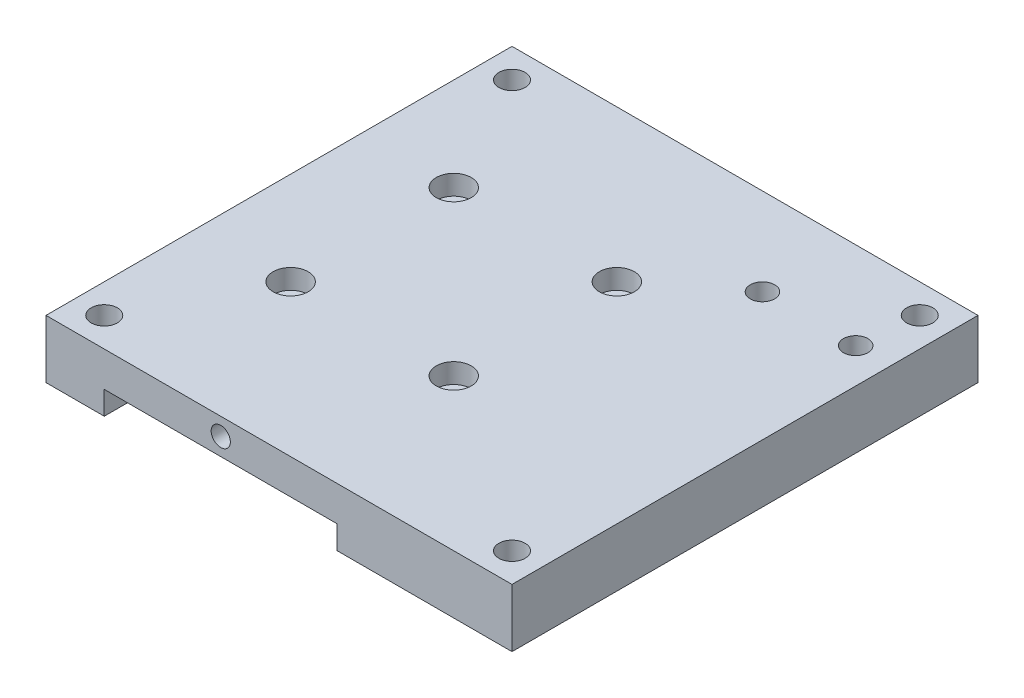
ISO-10303-21;
HEADER;
FILE_DESCRIPTION(('STEP AP214'),'2;1');
FILE_NAME('part.step','',(''),(''),'','','');
FILE_SCHEMA(('AUTOMOTIVE_DESIGN { 1 0 10303 214 1 1 1 1 }'));
ENDSEC;
DATA;
#1=APPLICATION_CONTEXT('core data for automotive mechanical design processes');
#2=APPLICATION_PROTOCOL_DEFINITION('international standard','automotive_design',2000,#1);
#3=PRODUCT_CONTEXT('',#1,'mechanical');
#4=PRODUCT('Part','Part','',(#3));
#5=PRODUCT_RELATED_PRODUCT_CATEGORY('part','',(#4));
#6=PRODUCT_DEFINITION_FORMATION('','',#4);
#7=PRODUCT_DEFINITION_CONTEXT('part definition',#1,'design');
#8=PRODUCT_DEFINITION('design','',#6,#7);
#9=PRODUCT_DEFINITION_SHAPE('','',#8);
#10=(LENGTH_UNIT() NAMED_UNIT(*) SI_UNIT(.MILLI.,.METRE.));
#11=(NAMED_UNIT(*) PLANE_ANGLE_UNIT() SI_UNIT($,.RADIAN.));
#12=(NAMED_UNIT(*) SI_UNIT($,.STERADIAN.) SOLID_ANGLE_UNIT());
#13=UNCERTAINTY_MEASURE_WITH_UNIT(LENGTH_MEASURE(1.E-05),#10,'distance_accuracy_value','');
#14=(GEOMETRIC_REPRESENTATION_CONTEXT(3) GLOBAL_UNCERTAINTY_ASSIGNED_CONTEXT((#13)) GLOBAL_UNIT_ASSIGNED_CONTEXT((#10,
#11,#12)) REPRESENTATION_CONTEXT('',''));
#15=CARTESIAN_POINT('',(0.,0.,0.));
#16=DIRECTION('',(0.,0.,1.));
#17=DIRECTION('',(1.,0.,0.));
#18=AXIS2_PLACEMENT_3D('',#15,#16,#17);
#19=CARTESIAN_POINT('',(0.,0.,0.));
#20=DIRECTION('',(0.,-1.,0.));
#21=DIRECTION('',(0.,0.,-1.));
#22=AXIS2_PLACEMENT_3D('',#19,#20,#21);
#23=PLANE('',#22);
#24=CARTESIAN_POINT('',(-35.,0.,35.));
#25=DIRECTION('',(0.,-1.,0.));
#26=DIRECTION('',(0.,0.,-1.));
#27=AXIS2_PLACEMENT_3D('',#24,#25,#26);
#28=CIRCLE('',#27,4.);
#29=CARTESIAN_POINT('',(-35.,0.,31.));
#30=VERTEX_POINT('',#29);
#31=EDGE_CURVE('E126',#30,#30,#28,.T.);
#32=ORIENTED_EDGE('',*,*,#31,.F.);
#33=EDGE_LOOP('',(#32));
#34=FACE_BOUND('',#33,.T.);
#35=CARTESIAN_POINT('',(-35.,0.,-35.));
#36=DIRECTION('',(0.,-1.,0.));
#37=DIRECTION('',(0.,0.,-1.));
#38=AXIS2_PLACEMENT_3D('',#35,#36,#37);
#39=CIRCLE('',#38,4.);
#40=CARTESIAN_POINT('',(-35.,0.,-39.));
#41=VERTEX_POINT('',#40);
#42=EDGE_CURVE('E167',#41,#41,#39,.T.);
#43=ORIENTED_EDGE('',*,*,#42,.F.);
#44=EDGE_LOOP('',(#43));
#45=FACE_BOUND('',#44,.T.);
#46=DIRECTION('',(0.,0.,1.));
#47=VECTOR('',#46,1.);
#48=CARTESIAN_POINT('',(-30.,0.,-40.));
#49=LINE('',#48,#47);
#50=CARTESIAN_POINT('',(-30.,0.,-40.));
#51=VERTEX_POINT('',#50);
#52=CARTESIAN_POINT('',(-30.,0.,40.));
#53=VERTEX_POINT('',#52);
#54=EDGE_CURVE('E238',#51,#53,#49,.T.);
#55=ORIENTED_EDGE('',*,*,#54,.T.);
#56=DIRECTION('',(1.,0.,0.));
#57=VECTOR('',#56,1.);
#58=CARTESIAN_POINT('',(-40.,0.,40.));
#59=LINE('',#58,#57);
#60=CARTESIAN_POINT('',(-40.,0.,40.));
#61=VERTEX_POINT('',#60);
#62=EDGE_CURVE('E257',#61,#53,#59,.T.);
#63=ORIENTED_EDGE('',*,*,#62,.F.);
#64=DIRECTION('',(0.,0.,1.));
#65=VECTOR('',#64,1.);
#66=CARTESIAN_POINT('',(-40.,0.,40.));
#67=LINE('',#66,#65);
#68=CARTESIAN_POINT('',(-40.,0.,-40.));
#69=VERTEX_POINT('',#68);
#70=EDGE_CURVE('E269',#69,#61,#67,.T.);
#71=ORIENTED_EDGE('',*,*,#70,.F.);
#72=DIRECTION('',(-1.,0.,0.));
#73=VECTOR('',#72,1.);
#74=CARTESIAN_POINT('',(-40.,0.,-40.));
#75=LINE('',#74,#73);
#76=EDGE_CURVE('E265',#51,#69,#75,.T.);
#77=ORIENTED_EDGE('',*,*,#76,.F.);
#78=EDGE_LOOP('',(#55,#63,#71,#77));
#79=FACE_BOUND('',#78,.T.);
#80=ADVANCED_FACE('F39',(#34,#45,#79),#23,.T.);
#81=CARTESIAN_POINT('',(40.,10.,40.));
#82=DIRECTION('',(-1.,0.,0.));
#83=DIRECTION('',(0.,0.,1.));
#84=AXIS2_PLACEMENT_3D('',#81,#82,#83);
#85=PLANE('',#84);
#86=DIRECTION('',(0.,0.,-1.));
#87=VECTOR('',#86,1.);
#88=CARTESIAN_POINT('',(40.,0.,40.));
#89=LINE('',#88,#87);
#90=CARTESIAN_POINT('',(40.,0.,40.));
#91=VERTEX_POINT('',#90);
#92=CARTESIAN_POINT('',(40.,0.,-40.));
#93=VERTEX_POINT('',#92);
#94=EDGE_CURVE('E248',#91,#93,#89,.T.);
#95=ORIENTED_EDGE('',*,*,#94,.T.);
#96=DIRECTION('',(0.,-1.,0.));
#97=VECTOR('',#96,1.);
#98=CARTESIAN_POINT('',(40.,10.,-40.));
#99=LINE('',#98,#97);
#100=CARTESIAN_POINT('',(40.,10.,-40.));
#101=VERTEX_POINT('',#100);
#102=EDGE_CURVE('E11',#101,#93,#99,.T.);
#103=ORIENTED_EDGE('',*,*,#102,.F.);
#104=DIRECTION('',(0.,0.,-1.));
#105=VECTOR('',#104,1.);
#106=CARTESIAN_POINT('',(40.,10.,40.));
#107=LINE('',#106,#105);
#108=CARTESIAN_POINT('',(40.,10.,40.));
#109=VERTEX_POINT('',#108);
#110=EDGE_CURVE('E255',#109,#101,#107,.T.);
#111=ORIENTED_EDGE('',*,*,#110,.F.);
#112=DIRECTION('',(0.,-1.,0.));
#113=VECTOR('',#112,1.);
#114=CARTESIAN_POINT('',(40.,10.,40.));
#115=LINE('',#114,#113);
#116=EDGE_CURVE('E262',#109,#91,#115,.T.);
#117=ORIENTED_EDGE('',*,*,#116,.T.);
#118=EDGE_LOOP('',(#95,#103,#111,#117));
#119=FACE_BOUND('',#118,.T.);
#120=ADVANCED_FACE('F41',(#119),#85,.F.);
#121=CARTESIAN_POINT('',(-40.,10.,-40.));
#122=DIRECTION('',(0.,0.,1.));
#123=DIRECTION('',(1.,0.,0.));
#124=AXIS2_PLACEMENT_3D('',#121,#122,#123);
#125=PLANE('',#124);
#126=DIRECTION('',(-1.,0.,0.));
#127=VECTOR('',#126,1.);
#128=CARTESIAN_POINT('',(-30.,4.,-40.));
#129=LINE('',#128,#127);
#130=CARTESIAN_POINT('',(10.,4.,-40.));
#131=VERTEX_POINT('',#130);
#132=CARTESIAN_POINT('',(-30.,4.,-40.));
#133=VERTEX_POINT('',#132);
#134=EDGE_CURVE('E235',#131,#133,#129,.T.);
#135=ORIENTED_EDGE('',*,*,#134,.T.);
#136=DIRECTION('',(0.,-1.,0.));
#137=VECTOR('',#136,1.);
#138=CARTESIAN_POINT('',(-30.,0.,-40.));
#139=LINE('',#138,#137);
#140=EDGE_CURVE('E230',#133,#51,#139,.T.);
#141=ORIENTED_EDGE('',*,*,#140,.T.);
#142=ORIENTED_EDGE('',*,*,#76,.T.);
#143=DIRECTION('',(0.,-1.,0.));
#144=VECTOR('',#143,1.);
#145=CARTESIAN_POINT('',(-40.,10.,-40.));
#146=LINE('',#145,#144);
#147=CARTESIAN_POINT('',(-40.,10.,-40.));
#148=VERTEX_POINT('',#147);
#149=EDGE_CURVE('E48',#148,#69,#146,.T.);
#150=ORIENTED_EDGE('',*,*,#149,.F.);
#151=DIRECTION('',(-1.,0.,0.));
#152=VECTOR('',#151,1.);
#153=CARTESIAN_POINT('',(-40.,10.,-40.));
#154=LINE('',#153,#152);
#155=EDGE_CURVE('E93',#101,#148,#154,.T.);
#156=ORIENTED_EDGE('',*,*,#155,.F.);
#157=ORIENTED_EDGE('',*,*,#102,.T.);
#158=CARTESIAN_POINT('',(10.,0.,-40.));
#159=VERTEX_POINT('',#158);
#160=EDGE_CURVE('E266',#93,#159,#75,.T.);
#161=ORIENTED_EDGE('',*,*,#160,.T.);
#162=DIRECTION('',(0.,1.,0.));
#163=VECTOR('',#162,1.);
#164=CARTESIAN_POINT('',(10.,0.,-40.));
#165=LINE('',#164,#163);
#166=EDGE_CURVE('E56',#159,#131,#165,.T.);
#167=ORIENTED_EDGE('',*,*,#166,.T.);
#168=EDGE_LOOP('',(#135,#141,#142,#150,#156,#157,#161,#167));
#169=FACE_BOUND('',#168,.T.);
#170=ADVANCED_FACE('F311',(#169),#125,.F.);
#171=CARTESIAN_POINT('',(-40.,10.,40.));
#172=DIRECTION('',(1.,0.,0.));
#173=DIRECTION('',(0.,0.,-1.));
#174=AXIS2_PLACEMENT_3D('',#171,#172,#173);
#175=PLANE('',#174);
#176=ORIENTED_EDGE('',*,*,#70,.T.);
#177=DIRECTION('',(0.,-1.,0.));
#178=VECTOR('',#177,1.);
#179=CARTESIAN_POINT('',(-40.,10.,40.));
#180=LINE('',#179,#178);
#181=CARTESIAN_POINT('',(-40.,10.,40.));
#182=VERTEX_POINT('',#181);
#183=EDGE_CURVE('E274',#182,#61,#180,.T.);
#184=ORIENTED_EDGE('',*,*,#183,.F.);
#185=DIRECTION('',(0.,0.,1.));
#186=VECTOR('',#185,1.);
#187=CARTESIAN_POINT('',(-40.,10.,40.));
#188=LINE('',#187,#186);
#189=EDGE_CURVE('E259',#148,#182,#188,.T.);
#190=ORIENTED_EDGE('',*,*,#189,.F.);
#191=ORIENTED_EDGE('',*,*,#149,.T.);
#192=EDGE_LOOP('',(#176,#184,#190,#191));
#193=FACE_BOUND('',#192,.T.);
#194=ADVANCED_FACE('F389',(#193),#175,.F.);
#195=CARTESIAN_POINT('',(-40.,10.,40.));
#196=DIRECTION('',(0.,0.,-1.));
#197=DIRECTION('',(-1.,0.,0.));
#198=AXIS2_PLACEMENT_3D('',#195,#196,#197);
#199=PLANE('',#198);
#200=CARTESIAN_POINT('',(-9.99999999999999,7.,40.));
#201=DIRECTION('',(0.,0.,1.));
#202=DIRECTION('',(1.,0.,0.));
#203=AXIS2_PLACEMENT_3D('',#200,#201,#202);
#204=CIRCLE('',#203,1.65);
#205=CARTESIAN_POINT('',(-8.34999999999999,7.,40.));
#206=VERTEX_POINT('',#205);
#207=EDGE_CURVE('E127',#206,#206,#204,.T.);
#208=ORIENTED_EDGE('',*,*,#207,.F.);
#209=EDGE_LOOP('',(#208));
#210=FACE_BOUND('',#209,.T.);
#211=ORIENTED_EDGE('',*,*,#62,.T.);
#212=DIRECTION('',(0.,-1.,0.));
#213=VECTOR('',#212,1.);
#214=CARTESIAN_POINT('',(-30.,0.,40.));
#215=LINE('',#214,#213);
#216=CARTESIAN_POINT('',(-30.,4.,40.));
#217=VERTEX_POINT('',#216);
#218=EDGE_CURVE('E239',#217,#53,#215,.T.);
#219=ORIENTED_EDGE('',*,*,#218,.F.);
#220=DIRECTION('',(-1.,0.,0.));
#221=VECTOR('',#220,1.);
#222=CARTESIAN_POINT('',(-30.,4.,40.));
#223=LINE('',#222,#221);
#224=CARTESIAN_POINT('',(10.,4.,40.));
#225=VERTEX_POINT('',#224);
#226=EDGE_CURVE('E233',#225,#217,#223,.T.);
#227=ORIENTED_EDGE('',*,*,#226,.F.);
#228=DIRECTION('',(0.,1.,0.));
#229=VECTOR('',#228,1.);
#230=CARTESIAN_POINT('',(10.,0.,40.));
#231=LINE('',#230,#229);
#232=CARTESIAN_POINT('',(10.,0.,40.));
#233=VERTEX_POINT('',#232);
#234=EDGE_CURVE('E241',#233,#225,#231,.T.);
#235=ORIENTED_EDGE('',*,*,#234,.F.);
#236=EDGE_CURVE('E86',#233,#91,#59,.T.);
#237=ORIENTED_EDGE('',*,*,#236,.T.);
#238=ORIENTED_EDGE('',*,*,#116,.F.);
#239=DIRECTION('',(1.,0.,0.));
#240=VECTOR('',#239,1.);
#241=CARTESIAN_POINT('',(-40.,10.,40.));
#242=LINE('',#241,#240);
#243=EDGE_CURVE('E65',#182,#109,#242,.T.);
#244=ORIENTED_EDGE('',*,*,#243,.F.);
#245=ORIENTED_EDGE('',*,*,#183,.T.);
#246=EDGE_LOOP('',(#211,#219,#227,#235,#237,#238,#244,#245));
#247=FACE_BOUND('',#246,.T.);
#248=ADVANCED_FACE('F327',(#210,#247),#199,.F.);
#249=CARTESIAN_POINT('',(0.,10.,0.));
#250=DIRECTION('',(0.,-1.,0.));
#251=DIRECTION('',(0.,0.,-1.));
#252=AXIS2_PLACEMENT_3D('',#249,#250,#251);
#253=PLANE('',#252);
#254=CARTESIAN_POINT('',(-35.,10.,35.));
#255=DIRECTION('',(0.,-1.,0.));
#256=DIRECTION('',(0.,0.,-1.));
#257=AXIS2_PLACEMENT_3D('',#254,#255,#256);
#258=CIRCLE('',#257,2.25);
#259=CARTESIAN_POINT('',(-35.,10.,32.75));
#260=VERTEX_POINT('',#259);
#261=EDGE_CURVE('E140',#260,#260,#258,.T.);
#262=ORIENTED_EDGE('',*,*,#261,.T.);
#263=EDGE_LOOP('',(#262));
#264=FACE_BOUND('',#263,.T.);
#265=CARTESIAN_POINT('',(35.,10.,35.));
#266=DIRECTION('',(0.,-1.,0.));
#267=DIRECTION('',(0.,0.,-1.));
#268=AXIS2_PLACEMENT_3D('',#265,#266,#267);
#269=CIRCLE('',#268,2.25);
#270=CARTESIAN_POINT('',(35.,10.,32.75));
#271=VERTEX_POINT('',#270);
#272=EDGE_CURVE('E152',#271,#271,#269,.T.);
#273=ORIENTED_EDGE('',*,*,#272,.T.);
#274=EDGE_LOOP('',(#273));
#275=FACE_BOUND('',#274,.T.);
#276=CARTESIAN_POINT('',(35.,10.,-35.));
#277=DIRECTION('',(0.,-1.,0.));
#278=DIRECTION('',(0.,0.,-1.));
#279=AXIS2_PLACEMENT_3D('',#276,#277,#278);
#280=CIRCLE('',#279,2.25);
#281=CARTESIAN_POINT('',(35.,10.,-37.25));
#282=VERTEX_POINT('',#281);
#283=EDGE_CURVE('E164',#282,#282,#280,.T.);
#284=ORIENTED_EDGE('',*,*,#283,.T.);
#285=EDGE_LOOP('',(#284));
#286=FACE_BOUND('',#285,.T.);
#287=CARTESIAN_POINT('',(-35.,10.,-35.));
#288=DIRECTION('',(0.,-1.,0.));
#289=DIRECTION('',(0.,0.,-1.));
#290=AXIS2_PLACEMENT_3D('',#287,#288,#289);
#291=CIRCLE('',#290,2.25);
#292=CARTESIAN_POINT('',(-35.,10.,-37.25));
#293=VERTEX_POINT('',#292);
#294=EDGE_CURVE('E176',#293,#293,#291,.T.);
#295=ORIENTED_EDGE('',*,*,#294,.T.);
#296=EDGE_LOOP('',(#295));
#297=FACE_BOUND('',#296,.T.);
#298=CARTESIAN_POINT('',(18.,10.,-25.));
#299=DIRECTION('',(0.,-1.,0.));
#300=DIRECTION('',(0.,0.,-1.));
#301=AXIS2_PLACEMENT_3D('',#298,#299,#300);
#302=CIRCLE('',#301,2.1);
#303=CARTESIAN_POINT('',(18.,10.,-27.1));
#304=VERTEX_POINT('',#303);
#305=EDGE_CURVE('E182',#304,#304,#302,.T.);
#306=ORIENTED_EDGE('',*,*,#305,.T.);
#307=EDGE_LOOP('',(#306));
#308=FACE_BOUND('',#307,.T.);
#309=CARTESIAN_POINT('',(34.,10.,-25.));
#310=DIRECTION('',(0.,-1.,0.));
#311=DIRECTION('',(0.,0.,-1.));
#312=AXIS2_PLACEMENT_3D('',#309,#310,#311);
#313=CIRCLE('',#312,2.1);
#314=CARTESIAN_POINT('',(34.,10.,-27.1));
#315=VERTEX_POINT('',#314);
#316=EDGE_CURVE('E188',#315,#315,#313,.T.);
#317=ORIENTED_EDGE('',*,*,#316,.T.);
#318=EDGE_LOOP('',(#317));
#319=FACE_BOUND('',#318,.T.);
#320=CARTESIAN_POINT('',(-24.,10.,-14.));
#321=DIRECTION('',(0.,1.,0.));
#322=DIRECTION('',(0.,0.,1.));
#323=AXIS2_PLACEMENT_3D('',#320,#321,#322);
#324=CIRCLE('',#323,3.);
#325=CARTESIAN_POINT('',(-24.,10.,-11.));
#326=VERTEX_POINT('',#325);
#327=EDGE_CURVE('E191',#326,#326,#324,.T.);
#328=ORIENTED_EDGE('',*,*,#327,.F.);
#329=EDGE_LOOP('',(#328));
#330=FACE_BOUND('',#329,.T.);
#331=CARTESIAN_POINT('',(4.00000000000001,10.,-14.));
#332=DIRECTION('',(0.,1.,0.));
#333=DIRECTION('',(0.,0.,1.));
#334=AXIS2_PLACEMENT_3D('',#331,#332,#333);
#335=CIRCLE('',#334,3.);
#336=CARTESIAN_POINT('',(4.00000000000001,10.,-11.));
#337=VERTEX_POINT('',#336);
#338=EDGE_CURVE('E200',#337,#337,#335,.T.);
#339=ORIENTED_EDGE('',*,*,#338,.F.);
#340=EDGE_LOOP('',(#339));
#341=FACE_BOUND('',#340,.T.);
#342=CARTESIAN_POINT('',(4.00000000000001,10.,14.));
#343=DIRECTION('',(0.,1.,0.));
#344=DIRECTION('',(0.,0.,1.));
#345=AXIS2_PLACEMENT_3D('',#342,#343,#344);
#346=CIRCLE('',#345,3.);
#347=CARTESIAN_POINT('',(4.00000000000001,10.,17.));
#348=VERTEX_POINT('',#347);
#349=EDGE_CURVE('E210',#348,#348,#346,.T.);
#350=ORIENTED_EDGE('',*,*,#349,.F.);
#351=EDGE_LOOP('',(#350));
#352=FACE_BOUND('',#351,.T.);
#353=CARTESIAN_POINT('',(-24.,10.,14.));
#354=DIRECTION('',(0.,1.,0.));
#355=DIRECTION('',(0.,0.,1.));
#356=AXIS2_PLACEMENT_3D('',#353,#354,#355);
#357=CIRCLE('',#356,3.);
#358=CARTESIAN_POINT('',(-24.,10.,17.));
#359=VERTEX_POINT('',#358);
#360=EDGE_CURVE('E220',#359,#359,#357,.T.);
#361=ORIENTED_EDGE('',*,*,#360,.F.);
#362=EDGE_LOOP('',(#361));
#363=FACE_BOUND('',#362,.T.);
#364=ORIENTED_EDGE('',*,*,#110,.T.);
#365=ORIENTED_EDGE('',*,*,#155,.T.);
#366=ORIENTED_EDGE('',*,*,#189,.T.);
#367=ORIENTED_EDGE('',*,*,#243,.T.);
#368=EDGE_LOOP('',(#364,#365,#366,#367));
#369=FACE_BOUND('',#368,.T.);
#370=ADVANCED_FACE('F319',(#264,#275,#286,#297,#308,#319,#330,#341,#352,#363,#369),#253,.F.);
#371=CARTESIAN_POINT('',(35.,0.,35.));
#372=DIRECTION('',(0.,-1.,0.));
#373=DIRECTION('',(0.,0.,-1.));
#374=AXIS2_PLACEMENT_3D('',#371,#372,#373);
#375=CIRCLE('',#374,4.);
#376=CARTESIAN_POINT('',(35.,0.,31.));
#377=VERTEX_POINT('',#376);
#378=EDGE_CURVE('E143',#377,#377,#375,.T.);
#379=ORIENTED_EDGE('',*,*,#378,.F.);
#380=EDGE_LOOP('',(#379));
#381=FACE_BOUND('',#380,.T.);
#382=CARTESIAN_POINT('',(35.,0.,-35.));
#383=DIRECTION('',(0.,-1.,0.));
#384=DIRECTION('',(0.,0.,-1.));
#385=AXIS2_PLACEMENT_3D('',#382,#383,#384);
#386=CIRCLE('',#385,4.);
#387=CARTESIAN_POINT('',(35.,0.,-39.));
#388=VERTEX_POINT('',#387);
#389=EDGE_CURVE('E155',#388,#388,#386,.T.);
#390=ORIENTED_EDGE('',*,*,#389,.F.);
#391=EDGE_LOOP('',(#390));
#392=FACE_BOUND('',#391,.T.);
#393=CARTESIAN_POINT('',(18.,0.,-25.));
#394=DIRECTION('',(0.,-1.,0.));
#395=DIRECTION('',(0.,0.,-1.));
#396=AXIS2_PLACEMENT_3D('',#393,#394,#395);
#397=CIRCLE('',#396,2.09999999999999);
#398=CARTESIAN_POINT('',(18.,0.,-27.1));
#399=VERTEX_POINT('',#398);
#400=EDGE_CURVE('E179',#399,#399,#397,.T.);
#401=ORIENTED_EDGE('',*,*,#400,.F.);
#402=EDGE_LOOP('',(#401));
#403=FACE_BOUND('',#402,.T.);
#404=CARTESIAN_POINT('',(34.,0.,-25.));
#405=DIRECTION('',(0.,-1.,0.));
#406=DIRECTION('',(0.,0.,-1.));
#407=AXIS2_PLACEMENT_3D('',#404,#405,#406);
#408=CIRCLE('',#407,2.09999999999998);
#409=CARTESIAN_POINT('',(34.,0.,-27.1));
#410=VERTEX_POINT('',#409);
#411=EDGE_CURVE('E185',#410,#410,#408,.T.);
#412=ORIENTED_EDGE('',*,*,#411,.F.);
#413=EDGE_LOOP('',(#412));
#414=FACE_BOUND('',#413,.T.);
#415=DIRECTION('',(0.,0.,1.));
#416=VECTOR('',#415,1.);
#417=CARTESIAN_POINT('',(10.,0.,-40.));
#418=LINE('',#417,#416);
#419=EDGE_CURVE('E251',#159,#233,#418,.T.);
#420=ORIENTED_EDGE('',*,*,#419,.F.);
#421=ORIENTED_EDGE('',*,*,#160,.F.);
#422=ORIENTED_EDGE('',*,*,#94,.F.);
#423=ORIENTED_EDGE('',*,*,#236,.F.);
#424=EDGE_LOOP('',(#420,#421,#422,#423));
#425=FACE_BOUND('',#424,.T.);
#426=ADVANCED_FACE('F307',(#381,#392,#403,#414,#425),#23,.T.);
#427=CARTESIAN_POINT('',(-30.,0.,-40.));
#428=DIRECTION('',(-1.,0.,0.));
#429=DIRECTION('',(0.,0.,1.));
#430=AXIS2_PLACEMENT_3D('',#427,#428,#429);
#431=PLANE('',#430);
#432=ORIENTED_EDGE('',*,*,#218,.T.);
#433=ORIENTED_EDGE('',*,*,#54,.F.);
#434=ORIENTED_EDGE('',*,*,#140,.F.);
#435=DIRECTION('',(0.,0.,1.));
#436=VECTOR('',#435,1.);
#437=CARTESIAN_POINT('',(-30.,4.,-40.));
#438=LINE('',#437,#436);
#439=EDGE_CURVE('E246',#133,#217,#438,.T.);
#440=ORIENTED_EDGE('',*,*,#439,.T.);
#441=EDGE_LOOP('',(#432,#433,#434,#440));
#442=FACE_BOUND('',#441,.T.);
#443=ADVANCED_FACE('F318',(#442),#431,.F.);
#444=CARTESIAN_POINT('',(-30.,4.,-40.));
#445=DIRECTION('',(0.,1.,0.));
#446=DIRECTION('',(0.,0.,1.));
#447=AXIS2_PLACEMENT_3D('',#444,#445,#446);
#448=PLANE('',#447);
#449=CARTESIAN_POINT('',(-24.,4.,-14.));
#450=DIRECTION('',(0.,1.,0.));
#451=DIRECTION('',(0.,0.,1.));
#452=AXIS2_PLACEMENT_3D('',#449,#450,#451);
#453=CIRCLE('',#452,1.7);
#454=CARTESIAN_POINT('',(-24.,4.,-12.3));
#455=VERTEX_POINT('',#454);
#456=EDGE_CURVE('E43',#455,#455,#453,.T.);
#457=ORIENTED_EDGE('',*,*,#456,.T.);
#458=EDGE_LOOP('',(#457));
#459=FACE_BOUND('',#458,.T.);
#460=CARTESIAN_POINT('',(4.00000000000001,4.,-14.));
#461=DIRECTION('',(0.,1.,0.));
#462=DIRECTION('',(0.,0.,1.));
#463=AXIS2_PLACEMENT_3D('',#460,#461,#462);
#464=CIRCLE('',#463,1.7);
#465=CARTESIAN_POINT('',(4.00000000000001,4.,-12.3));
#466=VERTEX_POINT('',#465);
#467=EDGE_CURVE('E209',#466,#466,#464,.T.);
#468=ORIENTED_EDGE('',*,*,#467,.T.);
#469=EDGE_LOOP('',(#468));
#470=FACE_BOUND('',#469,.T.);
#471=CARTESIAN_POINT('',(4.00000000000001,4.,14.));
#472=DIRECTION('',(0.,1.,0.));
#473=DIRECTION('',(0.,0.,1.));
#474=AXIS2_PLACEMENT_3D('',#471,#472,#473);
#475=CIRCLE('',#474,1.7);
#476=CARTESIAN_POINT('',(4.00000000000001,4.,15.7));
#477=VERTEX_POINT('',#476);
#478=EDGE_CURVE('E219',#477,#477,#475,.T.);
#479=ORIENTED_EDGE('',*,*,#478,.T.);
#480=EDGE_LOOP('',(#479));
#481=FACE_BOUND('',#480,.T.);
#482=CARTESIAN_POINT('',(-24.,4.,14.));
#483=DIRECTION('',(0.,1.,0.));
#484=DIRECTION('',(0.,0.,1.));
#485=AXIS2_PLACEMENT_3D('',#482,#483,#484);
#486=CIRCLE('',#485,1.7);
#487=CARTESIAN_POINT('',(-24.,4.,15.7));
#488=VERTEX_POINT('',#487);
#489=EDGE_CURVE('E229',#488,#488,#486,.T.);
#490=ORIENTED_EDGE('',*,*,#489,.T.);
#491=EDGE_LOOP('',(#490));
#492=FACE_BOUND('',#491,.T.);
#493=ORIENTED_EDGE('',*,*,#226,.T.);
#494=ORIENTED_EDGE('',*,*,#439,.F.);
#495=ORIENTED_EDGE('',*,*,#134,.F.);
#496=DIRECTION('',(0.,0.,1.));
#497=VECTOR('',#496,1.);
#498=CARTESIAN_POINT('',(10.,4.,-40.));
#499=LINE('',#498,#497);
#500=EDGE_CURVE('E249',#131,#225,#499,.T.);
#501=ORIENTED_EDGE('',*,*,#500,.T.);
#502=EDGE_LOOP('',(#493,#494,#495,#501));
#503=FACE_BOUND('',#502,.T.);
#504=ADVANCED_FACE('F285',(#459,#470,#481,#492,#503),#448,.F.);
#505=CARTESIAN_POINT('',(10.,0.,-40.));
#506=DIRECTION('',(1.,0.,0.));
#507=DIRECTION('',(0.,0.,-1.));
#508=AXIS2_PLACEMENT_3D('',#505,#506,#507);
#509=PLANE('',#508);
#510=ORIENTED_EDGE('',*,*,#234,.T.);
#511=ORIENTED_EDGE('',*,*,#500,.F.);
#512=ORIENTED_EDGE('',*,*,#166,.F.);
#513=ORIENTED_EDGE('',*,*,#419,.T.);
#514=EDGE_LOOP('',(#510,#511,#512,#513));
#515=FACE_BOUND('',#514,.T.);
#516=ADVANCED_FACE('F352',(#515),#509,.F.);
#517=CARTESIAN_POINT('',(-24.,10.,14.));
#518=DIRECTION('',(0.,1.,0.));
#519=DIRECTION('',(0.,0.,1.));
#520=AXIS2_PLACEMENT_3D('',#517,#518,#519);
#521=CYLINDRICAL_SURFACE('',#520,1.7);
#522=CARTESIAN_POINT('',(-24.,6.6,14.));
#523=DIRECTION('',(0.,1.,0.));
#524=DIRECTION('',(0.,0.,1.));
#525=AXIS2_PLACEMENT_3D('',#522,#523,#524);
#526=CIRCLE('',#525,1.7);
#527=CARTESIAN_POINT('',(-24.,6.6,15.7));
#528=VERTEX_POINT('',#527);
#529=EDGE_CURVE('E226',#528,#528,#526,.T.);
#530=ORIENTED_EDGE('',*,*,#529,.T.);
#531=EDGE_LOOP('',(#530));
#532=FACE_BOUND('',#531,.T.);
#533=ORIENTED_EDGE('',*,*,#489,.F.);
#534=EDGE_LOOP('',(#533));
#535=FACE_BOUND('',#534,.T.);
#536=ADVANCED_FACE('F354',(#532,#535),#521,.F.);
#537=CARTESIAN_POINT('',(-22.3,6.6,14.));
#538=DIRECTION('',(0.,-1.,0.));
#539=DIRECTION('',(0.,0.,-1.));
#540=AXIS2_PLACEMENT_3D('',#537,#538,#539);
#541=PLANE('',#540);
#542=ORIENTED_EDGE('',*,*,#529,.F.);
#543=EDGE_LOOP('',(#542));
#544=FACE_BOUND('',#543,.T.);
#545=CARTESIAN_POINT('',(-24.,6.6,14.));
#546=DIRECTION('',(0.,1.,0.));
#547=DIRECTION('',(0.,0.,1.));
#548=AXIS2_PLACEMENT_3D('',#545,#546,#547);
#549=CIRCLE('',#548,3.);
#550=CARTESIAN_POINT('',(-24.,6.6,17.));
#551=VERTEX_POINT('',#550);
#552=EDGE_CURVE('E223',#551,#551,#549,.T.);
#553=ORIENTED_EDGE('',*,*,#552,.T.);
#554=EDGE_LOOP('',(#553));
#555=FACE_BOUND('',#554,.T.);
#556=ADVANCED_FACE('F360',(#544,#555),#541,.F.);
#557=CARTESIAN_POINT('',(-24.,10.,14.));
#558=DIRECTION('',(0.,1.,0.));
#559=DIRECTION('',(0.,0.,1.));
#560=AXIS2_PLACEMENT_3D('',#557,#558,#559);
#561=CYLINDRICAL_SURFACE('',#560,3.);
#562=ORIENTED_EDGE('',*,*,#552,.F.);
#563=EDGE_LOOP('',(#562));
#564=FACE_BOUND('',#563,.T.);
#565=ORIENTED_EDGE('',*,*,#360,.T.);
#566=EDGE_LOOP('',(#565));
#567=FACE_BOUND('',#566,.T.);
#568=ADVANCED_FACE('F368',(#564,#567),#561,.F.);
#569=CARTESIAN_POINT('',(4.00000000000001,10.,14.));
#570=DIRECTION('',(0.,1.,0.));
#571=DIRECTION('',(0.,0.,1.));
#572=AXIS2_PLACEMENT_3D('',#569,#570,#571);
#573=CYLINDRICAL_SURFACE('',#572,1.7);
#574=CARTESIAN_POINT('',(4.00000000000001,6.6,14.));
#575=DIRECTION('',(0.,1.,0.));
#576=DIRECTION('',(0.,0.,1.));
#577=AXIS2_PLACEMENT_3D('',#574,#575,#576);
#578=CIRCLE('',#577,1.7);
#579=CARTESIAN_POINT('',(4.00000000000001,6.6,15.7));
#580=VERTEX_POINT('',#579);
#581=EDGE_CURVE('E216',#580,#580,#578,.T.);
#582=ORIENTED_EDGE('',*,*,#581,.T.);
#583=EDGE_LOOP('',(#582));
#584=FACE_BOUND('',#583,.T.);
#585=ORIENTED_EDGE('',*,*,#478,.F.);
#586=EDGE_LOOP('',(#585));
#587=FACE_BOUND('',#586,.T.);
#588=ADVANCED_FACE('F372',(#584,#587),#573,.F.);
#589=CARTESIAN_POINT('',(5.70000000000001,6.6,14.));
#590=DIRECTION('',(0.,-1.,0.));
#591=DIRECTION('',(0.,0.,-1.));
#592=AXIS2_PLACEMENT_3D('',#589,#590,#591);
#593=PLANE('',#592);
#594=ORIENTED_EDGE('',*,*,#581,.F.);
#595=EDGE_LOOP('',(#594));
#596=FACE_BOUND('',#595,.T.);
#597=CARTESIAN_POINT('',(4.00000000000001,6.6,14.));
#598=DIRECTION('',(0.,1.,0.));
#599=DIRECTION('',(0.,0.,1.));
#600=AXIS2_PLACEMENT_3D('',#597,#598,#599);
#601=CIRCLE('',#600,3.);
#602=CARTESIAN_POINT('',(4.00000000000001,6.6,17.));
#603=VERTEX_POINT('',#602);
#604=EDGE_CURVE('E213',#603,#603,#601,.T.);
#605=ORIENTED_EDGE('',*,*,#604,.T.);
#606=EDGE_LOOP('',(#605));
#607=FACE_BOUND('',#606,.T.);
#608=ADVANCED_FACE('F301',(#596,#607),#593,.F.);
#609=CARTESIAN_POINT('',(4.00000000000001,10.,14.));
#610=DIRECTION('',(0.,1.,0.));
#611=DIRECTION('',(0.,0.,1.));
#612=AXIS2_PLACEMENT_3D('',#609,#610,#611);
#613=CYLINDRICAL_SURFACE('',#612,3.);
#614=ORIENTED_EDGE('',*,*,#604,.F.);
#615=EDGE_LOOP('',(#614));
#616=FACE_BOUND('',#615,.T.);
#617=ORIENTED_EDGE('',*,*,#349,.T.);
#618=EDGE_LOOP('',(#617));
#619=FACE_BOUND('',#618,.T.);
#620=ADVANCED_FACE('F291',(#616,#619),#613,.F.);
#621=CARTESIAN_POINT('',(4.00000000000001,10.,-14.));
#622=DIRECTION('',(0.,1.,0.));
#623=DIRECTION('',(0.,0.,1.));
#624=AXIS2_PLACEMENT_3D('',#621,#622,#623);
#625=CYLINDRICAL_SURFACE('',#624,1.7);
#626=CARTESIAN_POINT('',(4.00000000000001,6.6,-14.));
#627=DIRECTION('',(0.,1.,0.));
#628=DIRECTION('',(0.,0.,1.));
#629=AXIS2_PLACEMENT_3D('',#626,#627,#628);
#630=CIRCLE('',#629,1.7);
#631=CARTESIAN_POINT('',(4.00000000000001,6.6,-12.3));
#632=VERTEX_POINT('',#631);
#633=EDGE_CURVE('E206',#632,#632,#630,.T.);
#634=ORIENTED_EDGE('',*,*,#633,.T.);
#635=EDGE_LOOP('',(#634));
#636=FACE_BOUND('',#635,.T.);
#637=ORIENTED_EDGE('',*,*,#467,.F.);
#638=EDGE_LOOP('',(#637));
#639=FACE_BOUND('',#638,.T.);
#640=ADVANCED_FACE('F288',(#636,#639),#625,.F.);
#641=CARTESIAN_POINT('',(5.70000000000001,6.6,-14.));
#642=DIRECTION('',(0.,-1.,0.));
#643=DIRECTION('',(0.,0.,-1.));
#644=AXIS2_PLACEMENT_3D('',#641,#642,#643);
#645=PLANE('',#644);
#646=ORIENTED_EDGE('',*,*,#633,.F.);
#647=EDGE_LOOP('',(#646));
#648=FACE_BOUND('',#647,.T.);
#649=CARTESIAN_POINT('',(4.00000000000001,6.6,-14.));
#650=DIRECTION('',(0.,1.,0.));
#651=DIRECTION('',(0.,0.,1.));
#652=AXIS2_PLACEMENT_3D('',#649,#650,#651);
#653=CIRCLE('',#652,3.);
#654=CARTESIAN_POINT('',(4.00000000000001,6.6,-11.));
#655=VERTEX_POINT('',#654);
#656=EDGE_CURVE('E203',#655,#655,#653,.T.);
#657=ORIENTED_EDGE('',*,*,#656,.T.);
#658=EDGE_LOOP('',(#657));
#659=FACE_BOUND('',#658,.T.);
#660=ADVANCED_FACE('F290',(#648,#659),#645,.F.);
#661=CARTESIAN_POINT('',(4.00000000000001,10.,-14.));
#662=DIRECTION('',(0.,1.,0.));
#663=DIRECTION('',(0.,0.,1.));
#664=AXIS2_PLACEMENT_3D('',#661,#662,#663);
#665=CYLINDRICAL_SURFACE('',#664,3.);
#666=ORIENTED_EDGE('',*,*,#656,.F.);
#667=EDGE_LOOP('',(#666));
#668=FACE_BOUND('',#667,.T.);
#669=ORIENTED_EDGE('',*,*,#338,.T.);
#670=EDGE_LOOP('',(#669));
#671=FACE_BOUND('',#670,.T.);
#672=ADVANCED_FACE('F298',(#668,#671),#665,.F.);
#673=CARTESIAN_POINT('',(-24.,10.,-14.));
#674=DIRECTION('',(0.,1.,0.));
#675=DIRECTION('',(0.,0.,1.));
#676=AXIS2_PLACEMENT_3D('',#673,#674,#675);
#677=CYLINDRICAL_SURFACE('',#676,1.7);
#678=CARTESIAN_POINT('',(-24.,6.6,-14.));
#679=DIRECTION('',(0.,1.,0.));
#680=DIRECTION('',(0.,0.,1.));
#681=AXIS2_PLACEMENT_3D('',#678,#679,#680);
#682=CIRCLE('',#681,1.7);
#683=CARTESIAN_POINT('',(-24.,6.6,-12.3));
#684=VERTEX_POINT('',#683);
#685=EDGE_CURVE('E197',#684,#684,#682,.T.);
#686=ORIENTED_EDGE('',*,*,#685,.T.);
#687=EDGE_LOOP('',(#686));
#688=FACE_BOUND('',#687,.T.);
#689=ORIENTED_EDGE('',*,*,#456,.F.);
#690=EDGE_LOOP('',(#689));
#691=FACE_BOUND('',#690,.T.);
#692=ADVANCED_FACE('F493',(#688,#691),#677,.F.);
#693=CARTESIAN_POINT('',(-22.3,6.6,-14.));
#694=DIRECTION('',(0.,-1.,0.));
#695=DIRECTION('',(0.,0.,-1.));
#696=AXIS2_PLACEMENT_3D('',#693,#694,#695);
#697=PLANE('',#696);
#698=ORIENTED_EDGE('',*,*,#685,.F.);
#699=EDGE_LOOP('',(#698));
#700=FACE_BOUND('',#699,.T.);
#701=CARTESIAN_POINT('',(-24.,6.6,-14.));
#702=DIRECTION('',(0.,1.,0.));
#703=DIRECTION('',(0.,0.,1.));
#704=AXIS2_PLACEMENT_3D('',#701,#702,#703);
#705=CIRCLE('',#704,3.);
#706=CARTESIAN_POINT('',(-24.,6.6,-11.));
#707=VERTEX_POINT('',#706);
#708=EDGE_CURVE('E194',#707,#707,#705,.T.);
#709=ORIENTED_EDGE('',*,*,#708,.T.);
#710=EDGE_LOOP('',(#709));
#711=FACE_BOUND('',#710,.T.);
#712=ADVANCED_FACE('F502',(#700,#711),#697,.F.);
#713=CARTESIAN_POINT('',(-24.,10.,-14.));
#714=DIRECTION('',(0.,1.,0.));
#715=DIRECTION('',(0.,0.,1.));
#716=AXIS2_PLACEMENT_3D('',#713,#714,#715);
#717=CYLINDRICAL_SURFACE('',#716,3.);
#718=ORIENTED_EDGE('',*,*,#708,.F.);
#719=EDGE_LOOP('',(#718));
#720=FACE_BOUND('',#719,.T.);
#721=ORIENTED_EDGE('',*,*,#327,.T.);
#722=EDGE_LOOP('',(#721));
#723=FACE_BOUND('',#722,.T.);
#724=ADVANCED_FACE('F511',(#720,#723),#717,.F.);
#725=CARTESIAN_POINT('',(34.,0.,-25.));
#726=DIRECTION('',(0.,-1.,0.));
#727=DIRECTION('',(0.,0.,-1.));
#728=AXIS2_PLACEMENT_3D('',#725,#726,#727);
#729=CYLINDRICAL_SURFACE('',#728,2.09999999999999);
#730=ORIENTED_EDGE('',*,*,#316,.F.);
#731=EDGE_LOOP('',(#730));
#732=FACE_BOUND('',#731,.T.);
#733=ORIENTED_EDGE('',*,*,#411,.T.);
#734=EDGE_LOOP('',(#733));
#735=FACE_BOUND('',#734,.T.);
#736=ADVANCED_FACE('F520',(#732,#735),#729,.F.);
#737=CARTESIAN_POINT('',(18.,0.,-25.));
#738=DIRECTION('',(0.,-1.,0.));
#739=DIRECTION('',(0.,0.,-1.));
#740=AXIS2_PLACEMENT_3D('',#737,#738,#739);
#741=CYLINDRICAL_SURFACE('',#740,2.09999999999999);
#742=ORIENTED_EDGE('',*,*,#305,.F.);
#743=EDGE_LOOP('',(#742));
#744=FACE_BOUND('',#743,.T.);
#745=ORIENTED_EDGE('',*,*,#400,.T.);
#746=EDGE_LOOP('',(#745));
#747=FACE_BOUND('',#746,.T.);
#748=ADVANCED_FACE('F529',(#744,#747),#741,.F.);
#749=CARTESIAN_POINT('',(-35.,0.,-35.));
#750=DIRECTION('',(0.,-1.,0.));
#751=DIRECTION('',(0.,0.,-1.));
#752=AXIS2_PLACEMENT_3D('',#749,#750,#751);
#753=CYLINDRICAL_SURFACE('',#752,2.25);
#754=ORIENTED_EDGE('',*,*,#294,.F.);
#755=EDGE_LOOP('',(#754));
#756=FACE_BOUND('',#755,.T.);
#757=CARTESIAN_POINT('',(-35.,5.,-35.));
#758=DIRECTION('',(0.,-1.,0.));
#759=DIRECTION('',(0.,0.,-1.));
#760=AXIS2_PLACEMENT_3D('',#757,#758,#759);
#761=CIRCLE('',#760,2.25);
#762=CARTESIAN_POINT('',(-35.,5.,-37.25));
#763=VERTEX_POINT('',#762);
#764=EDGE_CURVE('E173',#763,#763,#761,.T.);
#765=ORIENTED_EDGE('',*,*,#764,.T.);
#766=EDGE_LOOP('',(#765));
#767=FACE_BOUND('',#766,.T.);
#768=ADVANCED_FACE('F538',(#756,#767),#753,.F.);
#769=CARTESIAN_POINT('',(-32.75,5.,-35.));
#770=DIRECTION('',(0.,1.,0.));
#771=DIRECTION('',(0.,0.,1.));
#772=AXIS2_PLACEMENT_3D('',#769,#770,#771);
#773=PLANE('',#772);
#774=ORIENTED_EDGE('',*,*,#764,.F.);
#775=EDGE_LOOP('',(#774));
#776=FACE_BOUND('',#775,.T.);
#777=CARTESIAN_POINT('',(-35.,5.,-35.));
#778=DIRECTION('',(0.,-1.,0.));
#779=DIRECTION('',(0.,0.,-1.));
#780=AXIS2_PLACEMENT_3D('',#777,#778,#779);
#781=CIRCLE('',#780,4.);
#782=CARTESIAN_POINT('',(-35.,5.,-39.));
#783=VERTEX_POINT('',#782);
#784=EDGE_CURVE('E170',#783,#783,#781,.T.);
#785=ORIENTED_EDGE('',*,*,#784,.T.);
#786=EDGE_LOOP('',(#785));
#787=FACE_BOUND('',#786,.T.);
#788=ADVANCED_FACE('F547',(#776,#787),#773,.F.);
#789=CARTESIAN_POINT('',(-35.,0.,-35.));
#790=DIRECTION('',(0.,-1.,0.));
#791=DIRECTION('',(0.,0.,-1.));
#792=AXIS2_PLACEMENT_3D('',#789,#790,#791);
#793=CYLINDRICAL_SURFACE('',#792,4.);
#794=ORIENTED_EDGE('',*,*,#784,.F.);
#795=EDGE_LOOP('',(#794));
#796=FACE_BOUND('',#795,.T.);
#797=ORIENTED_EDGE('',*,*,#42,.T.);
#798=EDGE_LOOP('',(#797));
#799=FACE_BOUND('',#798,.T.);
#800=ADVANCED_FACE('F556',(#796,#799),#793,.F.);
#801=CARTESIAN_POINT('',(35.,0.,-35.));
#802=DIRECTION('',(0.,-1.,0.));
#803=DIRECTION('',(0.,0.,-1.));
#804=AXIS2_PLACEMENT_3D('',#801,#802,#803);
#805=CYLINDRICAL_SURFACE('',#804,2.25);
#806=ORIENTED_EDGE('',*,*,#283,.F.);
#807=EDGE_LOOP('',(#806));
#808=FACE_BOUND('',#807,.T.);
#809=CARTESIAN_POINT('',(35.,5.,-35.));
#810=DIRECTION('',(0.,-1.,0.));
#811=DIRECTION('',(0.,0.,-1.));
#812=AXIS2_PLACEMENT_3D('',#809,#810,#811);
#813=CIRCLE('',#812,2.25);
#814=CARTESIAN_POINT('',(35.,5.,-37.25));
#815=VERTEX_POINT('',#814);
#816=EDGE_CURVE('E161',#815,#815,#813,.T.);
#817=ORIENTED_EDGE('',*,*,#816,.T.);
#818=EDGE_LOOP('',(#817));
#819=FACE_BOUND('',#818,.T.);
#820=ADVANCED_FACE('F565',(#808,#819),#805,.F.);
#821=CARTESIAN_POINT('',(37.25,5.,-35.));
#822=DIRECTION('',(0.,1.,0.));
#823=DIRECTION('',(0.,0.,1.));
#824=AXIS2_PLACEMENT_3D('',#821,#822,#823);
#825=PLANE('',#824);
#826=ORIENTED_EDGE('',*,*,#816,.F.);
#827=EDGE_LOOP('',(#826));
#828=FACE_BOUND('',#827,.T.);
#829=CARTESIAN_POINT('',(35.,5.,-35.));
#830=DIRECTION('',(0.,-1.,0.));
#831=DIRECTION('',(0.,0.,-1.));
#832=AXIS2_PLACEMENT_3D('',#829,#830,#831);
#833=CIRCLE('',#832,4.);
#834=CARTESIAN_POINT('',(35.,5.,-39.));
#835=VERTEX_POINT('',#834);
#836=EDGE_CURVE('E158',#835,#835,#833,.T.);
#837=ORIENTED_EDGE('',*,*,#836,.T.);
#838=EDGE_LOOP('',(#837));
#839=FACE_BOUND('',#838,.T.);
#840=ADVANCED_FACE('F574',(#828,#839),#825,.F.);
#841=CARTESIAN_POINT('',(35.,0.,-35.));
#842=DIRECTION('',(0.,-1.,0.));
#843=DIRECTION('',(0.,0.,-1.));
#844=AXIS2_PLACEMENT_3D('',#841,#842,#843);
#845=CYLINDRICAL_SURFACE('',#844,4.);
#846=ORIENTED_EDGE('',*,*,#836,.F.);
#847=EDGE_LOOP('',(#846));
#848=FACE_BOUND('',#847,.T.);
#849=ORIENTED_EDGE('',*,*,#389,.T.);
#850=EDGE_LOOP('',(#849));
#851=FACE_BOUND('',#850,.T.);
#852=ADVANCED_FACE('F583',(#848,#851),#845,.F.);
#853=CARTESIAN_POINT('',(35.,0.,35.));
#854=DIRECTION('',(0.,-1.,0.));
#855=DIRECTION('',(0.,0.,-1.));
#856=AXIS2_PLACEMENT_3D('',#853,#854,#855);
#857=CYLINDRICAL_SURFACE('',#856,2.25);
#858=ORIENTED_EDGE('',*,*,#272,.F.);
#859=EDGE_LOOP('',(#858));
#860=FACE_BOUND('',#859,.T.);
#861=CARTESIAN_POINT('',(35.,5.,35.));
#862=DIRECTION('',(0.,-1.,0.));
#863=DIRECTION('',(0.,0.,-1.));
#864=AXIS2_PLACEMENT_3D('',#861,#862,#863);
#865=CIRCLE('',#864,2.25);
#866=CARTESIAN_POINT('',(35.,5.,32.75));
#867=VERTEX_POINT('',#866);
#868=EDGE_CURVE('E149',#867,#867,#865,.T.);
#869=ORIENTED_EDGE('',*,*,#868,.T.);
#870=EDGE_LOOP('',(#869));
#871=FACE_BOUND('',#870,.T.);
#872=ADVANCED_FACE('F592',(#860,#871),#857,.F.);
#873=CARTESIAN_POINT('',(37.25,5.,35.));
#874=DIRECTION('',(0.,1.,0.));
#875=DIRECTION('',(0.,0.,1.));
#876=AXIS2_PLACEMENT_3D('',#873,#874,#875);
#877=PLANE('',#876);
#878=ORIENTED_EDGE('',*,*,#868,.F.);
#879=EDGE_LOOP('',(#878));
#880=FACE_BOUND('',#879,.T.);
#881=CARTESIAN_POINT('',(35.,5.,35.));
#882=DIRECTION('',(0.,-1.,0.));
#883=DIRECTION('',(0.,0.,-1.));
#884=AXIS2_PLACEMENT_3D('',#881,#882,#883);
#885=CIRCLE('',#884,4.);
#886=CARTESIAN_POINT('',(35.,5.,31.));
#887=VERTEX_POINT('',#886);
#888=EDGE_CURVE('E146',#887,#887,#885,.T.);
#889=ORIENTED_EDGE('',*,*,#888,.T.);
#890=EDGE_LOOP('',(#889));
#891=FACE_BOUND('',#890,.T.);
#892=ADVANCED_FACE('F601',(#880,#891),#877,.F.);
#893=CARTESIAN_POINT('',(35.,0.,35.));
#894=DIRECTION('',(0.,-1.,0.));
#895=DIRECTION('',(0.,0.,-1.));
#896=AXIS2_PLACEMENT_3D('',#893,#894,#895);
#897=CYLINDRICAL_SURFACE('',#896,4.);
#898=ORIENTED_EDGE('',*,*,#888,.F.);
#899=EDGE_LOOP('',(#898));
#900=FACE_BOUND('',#899,.T.);
#901=ORIENTED_EDGE('',*,*,#378,.T.);
#902=EDGE_LOOP('',(#901));
#903=FACE_BOUND('',#902,.T.);
#904=ADVANCED_FACE('F610',(#900,#903),#897,.F.);
#905=CARTESIAN_POINT('',(-35.,0.,35.));
#906=DIRECTION('',(0.,-1.,0.));
#907=DIRECTION('',(0.,0.,-1.));
#908=AXIS2_PLACEMENT_3D('',#905,#906,#907);
#909=CYLINDRICAL_SURFACE('',#908,2.25);
#910=ORIENTED_EDGE('',*,*,#261,.F.);
#911=EDGE_LOOP('',(#910));
#912=FACE_BOUND('',#911,.T.);
#913=CARTESIAN_POINT('',(-35.,5.,35.));
#914=DIRECTION('',(0.,-1.,0.));
#915=DIRECTION('',(0.,0.,-1.));
#916=AXIS2_PLACEMENT_3D('',#913,#914,#915);
#917=CIRCLE('',#916,2.25);
#918=CARTESIAN_POINT('',(-35.,5.,32.75));
#919=VERTEX_POINT('',#918);
#920=EDGE_CURVE('E137',#919,#919,#917,.T.);
#921=ORIENTED_EDGE('',*,*,#920,.T.);
#922=EDGE_LOOP('',(#921));
#923=FACE_BOUND('',#922,.T.);
#924=ADVANCED_FACE('F619',(#912,#923),#909,.F.);
#925=CARTESIAN_POINT('',(-32.75,5.,35.));
#926=DIRECTION('',(0.,1.,0.));
#927=DIRECTION('',(0.,0.,1.));
#928=AXIS2_PLACEMENT_3D('',#925,#926,#927);
#929=PLANE('',#928);
#930=ORIENTED_EDGE('',*,*,#920,.F.);
#931=EDGE_LOOP('',(#930));
#932=FACE_BOUND('',#931,.T.);
#933=CARTESIAN_POINT('',(-35.,5.,35.));
#934=DIRECTION('',(0.,-1.,0.));
#935=DIRECTION('',(0.,0.,-1.));
#936=AXIS2_PLACEMENT_3D('',#933,#934,#935);
#937=CIRCLE('',#936,4.);
#938=CARTESIAN_POINT('',(-35.,5.,31.));
#939=VERTEX_POINT('',#938);
#940=EDGE_CURVE('E130',#939,#939,#937,.T.);
#941=ORIENTED_EDGE('',*,*,#940,.T.);
#942=EDGE_LOOP('',(#941));
#943=FACE_BOUND('',#942,.T.);
#944=ADVANCED_FACE('F628',(#932,#943),#929,.F.);
#945=CARTESIAN_POINT('',(-35.,0.,35.));
#946=DIRECTION('',(0.,-1.,0.));
#947=DIRECTION('',(0.,0.,-1.));
#948=AXIS2_PLACEMENT_3D('',#945,#946,#947);
#949=CYLINDRICAL_SURFACE('',#948,4.);
#950=ORIENTED_EDGE('',*,*,#940,.F.);
#951=EDGE_LOOP('',(#950));
#952=FACE_BOUND('',#951,.T.);
#953=ORIENTED_EDGE('',*,*,#31,.T.);
#954=EDGE_LOOP('',(#953));
#955=FACE_BOUND('',#954,.T.);
#956=ADVANCED_FACE('F120',(#952,#955),#949,.F.);
#957=CARTESIAN_POINT('',(-9.99999999999999,7.,29.9));
#958=DIRECTION('',(0.,0.,1.));
#959=DIRECTION('',(1.,0.,0.));
#960=AXIS2_PLACEMENT_3D('',#957,#958,#959);
#961=CONICAL_SURFACE('',#960,1.65,1.02974425867665);
#962=CARTESIAN_POINT('',(-9.99999999999999,7.,28.9085799786045));
#963=VERTEX_POINT('',#962);
#964=VERTEX_LOOP('',#963);
#965=FACE_BOUND('',#964,.T.);
#966=CARTESIAN_POINT('',(-9.99999999999999,7.,29.9));
#967=DIRECTION('',(0.,0.,1.));
#968=DIRECTION('',(1.,0.,0.));
#969=AXIS2_PLACEMENT_3D('',#966,#967,#968);
#970=CIRCLE('',#969,1.65);
#971=CARTESIAN_POINT('',(-8.34999999999999,7.,29.9));
#972=VERTEX_POINT('',#971);
#973=EDGE_CURVE('E124',#972,#972,#970,.T.);
#974=ORIENTED_EDGE('',*,*,#973,.T.);
#975=EDGE_LOOP('',(#974));
#976=FACE_BOUND('',#975,.T.);
#977=ADVANCED_FACE('F116',(#965,#976),#961,.F.);
#978=CARTESIAN_POINT('',(-9.99999999999999,7.,40.));
#979=DIRECTION('',(0.,0.,1.));
#980=DIRECTION('',(1.,0.,0.));
#981=AXIS2_PLACEMENT_3D('',#978,#979,#980);
#982=CYLINDRICAL_SURFACE('',#981,1.65);
#983=ORIENTED_EDGE('',*,*,#973,.F.);
#984=EDGE_LOOP('',(#983));
#985=FACE_BOUND('',#984,.T.);
#986=ORIENTED_EDGE('',*,*,#207,.T.);
#987=EDGE_LOOP('',(#986));
#988=FACE_BOUND('',#987,.T.);
#989=ADVANCED_FACE('F119',(#985,#988),#982,.F.);
#990=CLOSED_SHELL('',(#80,#120,#170,#194,#248,#370,#426,#443,#504,#516,#536,#556,#568,#588,#608,
#620,#640,#660,#672,#692,#712,#724,#736,#748,#768,#788,#800,#820,#840,#852,#872,#892,#904,#924,
#944,#956,#977,#989));
#991=MANIFOLD_SOLID_BREP('B2',#990);
#992=ADVANCED_BREP_SHAPE_REPRESENTATION('',(#18,#991),#14);
#993=SHAPE_DEFINITION_REPRESENTATION(#9,#992);
ENDSEC;
END-ISO-10303-21;
